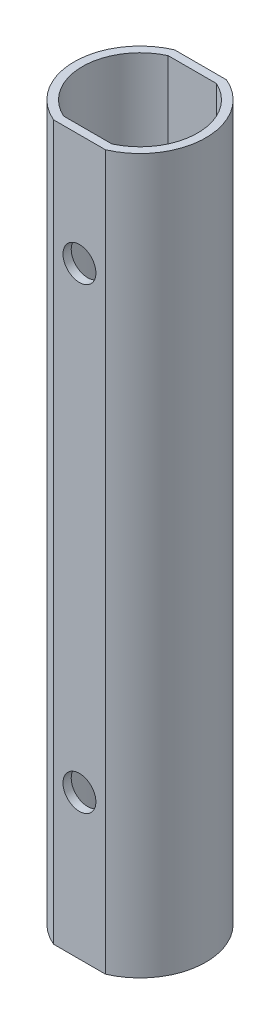
ISO-10303-21;
HEADER;
FILE_DESCRIPTION(('STEP AP214'),'2;1');
FILE_NAME('part.step','',(''),(''),'','','');
FILE_SCHEMA(('AUTOMOTIVE_DESIGN { 1 0 10303 214 1 1 1 1 }'));
ENDSEC;
DATA;
#1=APPLICATION_CONTEXT('core data for automotive mechanical design processes');
#2=APPLICATION_PROTOCOL_DEFINITION('international standard','automotive_design',2000,#1);
#3=PRODUCT_CONTEXT('',#1,'mechanical');
#4=PRODUCT('Part','Part','',(#3));
#5=PRODUCT_RELATED_PRODUCT_CATEGORY('part','',(#4));
#6=PRODUCT_DEFINITION_FORMATION('','',#4);
#7=PRODUCT_DEFINITION_CONTEXT('part definition',#1,'design');
#8=PRODUCT_DEFINITION('design','',#6,#7);
#9=PRODUCT_DEFINITION_SHAPE('','',#8);
#10=(LENGTH_UNIT() NAMED_UNIT(*) SI_UNIT(.MILLI.,.METRE.));
#11=(NAMED_UNIT(*) PLANE_ANGLE_UNIT() SI_UNIT($,.RADIAN.));
#12=(NAMED_UNIT(*) SI_UNIT($,.STERADIAN.) SOLID_ANGLE_UNIT());
#13=UNCERTAINTY_MEASURE_WITH_UNIT(LENGTH_MEASURE(1.E-05),#10,'distance_accuracy_value','');
#14=(GEOMETRIC_REPRESENTATION_CONTEXT(3) GLOBAL_UNCERTAINTY_ASSIGNED_CONTEXT((#13)) GLOBAL_UNIT_ASSIGNED_CONTEXT((#10,
#11,#12)) REPRESENTATION_CONTEXT('',''));
#15=CARTESIAN_POINT('',(0.,0.,0.));
#16=DIRECTION('',(0.,0.,1.));
#17=DIRECTION('',(1.,0.,0.));
#18=AXIS2_PLACEMENT_3D('',#15,#16,#17);
#19=CARTESIAN_POINT('',(0.,137.66,0.));
#20=DIRECTION('',(0.,1.,0.));
#21=DIRECTION('',(0.,0.,1.));
#22=AXIS2_PLACEMENT_3D('',#19,#20,#21);
#23=PLANE('',#22);
#24=CARTESIAN_POINT('',(0.,137.66,0.));
#25=DIRECTION('',(0.,1.,0.));
#26=DIRECTION('',(0.,0.,1.));
#27=AXIS2_PLACEMENT_3D('',#24,#25,#26);
#28=CIRCLE('',#27,12.7);
#29=CARTESIAN_POINT('',(-5.,137.66,-11.6743308159397));
#30=VERTEX_POINT('',#29);
#31=CARTESIAN_POINT('',(-5.,137.66,11.6743308159397));
#32=VERTEX_POINT('',#31);
#33=EDGE_CURVE('E142',#30,#32,#28,.T.);
#34=ORIENTED_EDGE('',*,*,#33,.T.);
#35=DIRECTION('',(1.,0.,0.));
#36=VECTOR('',#35,1.);
#37=CARTESIAN_POINT('',(-5.,137.66,11.6743308159397));
#38=LINE('',#37,#36);
#39=CARTESIAN_POINT('',(5.,137.66,11.6743308159397));
#40=VERTEX_POINT('',#39);
#41=EDGE_CURVE('E145',#32,#40,#38,.T.);
#42=ORIENTED_EDGE('',*,*,#41,.T.);
#43=CARTESIAN_POINT('',(0.,137.66,0.));
#44=DIRECTION('',(0.,1.,0.));
#45=DIRECTION('',(0.,0.,1.));
#46=AXIS2_PLACEMENT_3D('',#43,#44,#45);
#47=CIRCLE('',#46,12.7);
#48=CARTESIAN_POINT('',(5.,137.66,-11.6743308159397));
#49=VERTEX_POINT('',#48);
#50=EDGE_CURVE('E148',#40,#49,#47,.T.);
#51=ORIENTED_EDGE('',*,*,#50,.T.);
#52=DIRECTION('',(-1.,0.,0.));
#53=VECTOR('',#52,1.);
#54=CARTESIAN_POINT('',(-5.,137.66,-11.6743308159397));
#55=LINE('',#54,#53);
#56=EDGE_CURVE('E150',#49,#30,#55,.T.);
#57=ORIENTED_EDGE('',*,*,#56,.T.);
#58=EDGE_LOOP('',(#34,#42,#51,#57));
#59=FACE_BOUND('',#58,.T.);
#60=DIRECTION('',(1.,0.,0.));
#61=VECTOR('',#60,1.);
#62=CARTESIAN_POINT('',(-4.66299263784629,137.66,10.0868308159397));
#63=LINE('',#62,#61);
#64=CARTESIAN_POINT('',(-4.66299263784629,137.66,10.0868308159397));
#65=VERTEX_POINT('',#64);
#66=CARTESIAN_POINT('',(4.66299263784629,137.66,10.0868308159397));
#67=VERTEX_POINT('',#66);
#68=EDGE_CURVE('E112',#65,#67,#63,.T.);
#69=ORIENTED_EDGE('',*,*,#68,.F.);
#70=CARTESIAN_POINT('',(0.,137.66,0.));
#71=DIRECTION('',(0.,1.,0.));
#72=DIRECTION('',(0.,0.,1.));
#73=AXIS2_PLACEMENT_3D('',#70,#71,#72);
#74=CIRCLE('',#73,11.1125);
#75=CARTESIAN_POINT('',(-4.66299263784628,137.66,-10.0868308159397));
#76=VERTEX_POINT('',#75);
#77=EDGE_CURVE('E104',#76,#65,#74,.T.);
#78=ORIENTED_EDGE('',*,*,#77,.F.);
#79=DIRECTION('',(-1.,0.,0.));
#80=VECTOR('',#79,1.);
#81=CARTESIAN_POINT('',(-4.66299263784628,137.66,-10.0868308159397));
#82=LINE('',#81,#80);
#83=CARTESIAN_POINT('',(4.66299263784629,137.66,-10.0868308159397));
#84=VERTEX_POINT('',#83);
#85=EDGE_CURVE('E126',#84,#76,#82,.T.);
#86=ORIENTED_EDGE('',*,*,#85,.F.);
#87=CARTESIAN_POINT('',(0.,137.66,0.));
#88=DIRECTION('',(0.,1.,0.));
#89=DIRECTION('',(0.,0.,1.));
#90=AXIS2_PLACEMENT_3D('',#87,#88,#89);
#91=CIRCLE('',#90,11.1125);
#92=EDGE_CURVE('E124',#67,#84,#91,.T.);
#93=ORIENTED_EDGE('',*,*,#92,.F.);
#94=EDGE_LOOP('',(#69,#78,#86,#93));
#95=FACE_BOUND('',#94,.T.);
#96=ADVANCED_FACE('F37',(#59,#95),#23,.T.);
#97=CARTESIAN_POINT('',(0.,0.,0.));
#98=DIRECTION('',(0.,1.,0.));
#99=DIRECTION('',(0.,0.,1.));
#100=AXIS2_PLACEMENT_3D('',#97,#98,#99);
#101=PLANE('',#100);
#102=CARTESIAN_POINT('',(0.,0.,0.));
#103=DIRECTION('',(0.,1.,0.));
#104=DIRECTION('',(0.,0.,1.));
#105=AXIS2_PLACEMENT_3D('',#102,#103,#104);
#106=CIRCLE('',#105,12.7);
#107=CARTESIAN_POINT('',(-5.,0.,-11.6743308159397));
#108=VERTEX_POINT('',#107);
#109=CARTESIAN_POINT('',(-5.,0.,11.6743308159397));
#110=VERTEX_POINT('',#109);
#111=EDGE_CURVE('E120',#108,#110,#106,.T.);
#112=ORIENTED_EDGE('',*,*,#111,.F.);
#113=DIRECTION('',(-1.,0.,0.));
#114=VECTOR('',#113,1.);
#115=CARTESIAN_POINT('',(-5.,0.,-11.6743308159397));
#116=LINE('',#115,#114);
#117=CARTESIAN_POINT('',(5.,0.,-11.6743308159397));
#118=VERTEX_POINT('',#117);
#119=EDGE_CURVE('E146',#118,#108,#116,.T.);
#120=ORIENTED_EDGE('',*,*,#119,.F.);
#121=CARTESIAN_POINT('',(0.,0.,0.));
#122=DIRECTION('',(0.,1.,0.));
#123=DIRECTION('',(0.,0.,1.));
#124=AXIS2_PLACEMENT_3D('',#121,#122,#123);
#125=CIRCLE('',#124,12.7);
#126=CARTESIAN_POINT('',(5.,0.,11.6743308159397));
#127=VERTEX_POINT('',#126);
#128=EDGE_CURVE('E157',#127,#118,#125,.T.);
#129=ORIENTED_EDGE('',*,*,#128,.F.);
#130=DIRECTION('',(1.,0.,0.));
#131=VECTOR('',#130,1.);
#132=CARTESIAN_POINT('',(-5.,0.,11.6743308159397));
#133=LINE('',#132,#131);
#134=EDGE_CURVE('E155',#110,#127,#133,.T.);
#135=ORIENTED_EDGE('',*,*,#134,.F.);
#136=EDGE_LOOP('',(#112,#120,#129,#135));
#137=FACE_BOUND('',#136,.T.);
#138=CARTESIAN_POINT('',(0.,0.,0.));
#139=DIRECTION('',(0.,1.,0.));
#140=DIRECTION('',(0.,0.,1.));
#141=AXIS2_PLACEMENT_3D('',#138,#139,#140);
#142=CIRCLE('',#141,11.1125);
#143=CARTESIAN_POINT('',(-4.66299263784628,0.,-10.0868308159397));
#144=VERTEX_POINT('',#143);
#145=CARTESIAN_POINT('',(-4.66299263784629,0.,10.0868308159397));
#146=VERTEX_POINT('',#145);
#147=EDGE_CURVE('E62',#144,#146,#142,.T.);
#148=ORIENTED_EDGE('',*,*,#147,.T.);
#149=DIRECTION('',(1.,0.,0.));
#150=VECTOR('',#149,1.);
#151=CARTESIAN_POINT('',(-4.66299263784629,0.,10.0868308159397));
#152=LINE('',#151,#150);
#153=CARTESIAN_POINT('',(4.66299263784629,0.,10.0868308159397));
#154=VERTEX_POINT('',#153);
#155=EDGE_CURVE('E119',#146,#154,#152,.T.);
#156=ORIENTED_EDGE('',*,*,#155,.T.);
#157=CARTESIAN_POINT('',(0.,0.,0.));
#158=DIRECTION('',(0.,1.,0.));
#159=DIRECTION('',(0.,0.,1.));
#160=AXIS2_PLACEMENT_3D('',#157,#158,#159);
#161=CIRCLE('',#160,11.1125);
#162=CARTESIAN_POINT('',(4.66299263784629,0.,-10.0868308159397));
#163=VERTEX_POINT('',#162);
#164=EDGE_CURVE('E134',#154,#163,#161,.T.);
#165=ORIENTED_EDGE('',*,*,#164,.T.);
#166=DIRECTION('',(-1.,0.,0.));
#167=VECTOR('',#166,1.);
#168=CARTESIAN_POINT('',(-4.66299263784628,0.,-10.0868308159397));
#169=LINE('',#168,#167);
#170=EDGE_CURVE('E113',#163,#144,#169,.T.);
#171=ORIENTED_EDGE('',*,*,#170,.T.);
#172=EDGE_LOOP('',(#148,#156,#165,#171));
#173=FACE_BOUND('',#172,.T.);
#174=ADVANCED_FACE('F204',(#137,#173),#101,.F.);
#175=CARTESIAN_POINT('',(0.,137.66,0.));
#176=DIRECTION('',(0.,-1.,0.));
#177=DIRECTION('',(0.,0.,-1.));
#178=AXIS2_PLACEMENT_3D('',#175,#176,#177);
#179=CYLINDRICAL_SURFACE('',#178,12.7);
#180=ORIENTED_EDGE('',*,*,#111,.T.);
#181=DIRECTION('',(0.,-1.,0.));
#182=VECTOR('',#181,1.);
#183=CARTESIAN_POINT('',(-5.,137.66,11.6743308159397));
#184=LINE('',#183,#182);
#185=EDGE_CURVE('E11',#32,#110,#184,.T.);
#186=ORIENTED_EDGE('',*,*,#185,.F.);
#187=ORIENTED_EDGE('',*,*,#33,.F.);
#188=DIRECTION('',(0.,-1.,0.));
#189=VECTOR('',#188,1.);
#190=CARTESIAN_POINT('',(-5.,137.66,-11.6743308159397));
#191=LINE('',#190,#189);
#192=EDGE_CURVE('E152',#30,#108,#191,.T.);
#193=ORIENTED_EDGE('',*,*,#192,.T.);
#194=EDGE_LOOP('',(#180,#186,#187,#193));
#195=FACE_BOUND('',#194,.T.);
#196=ADVANCED_FACE('F39',(#195),#179,.T.);
#197=CARTESIAN_POINT('',(-5.,137.66,11.6743308159397));
#198=DIRECTION('',(0.,0.,-1.));
#199=DIRECTION('',(-1.,0.,0.));
#200=AXIS2_PLACEMENT_3D('',#197,#198,#199);
#201=PLANE('',#200);
#202=CARTESIAN_POINT('',(0.,27.85,11.6743308159397));
#203=DIRECTION('',(0.,0.,-1.));
#204=DIRECTION('',(-1.,0.,0.));
#205=AXIS2_PLACEMENT_3D('',#202,#203,#204);
#206=CIRCLE('',#205,3.175);
#207=CARTESIAN_POINT('',(-3.175,27.85,11.6743308159397));
#208=VERTEX_POINT('',#207);
#209=EDGE_CURVE('E169',#208,#208,#206,.F.);
#210=ORIENTED_EDGE('',*,*,#209,.F.);
#211=EDGE_LOOP('',(#210));
#212=FACE_BOUND('',#211,.T.);
#213=CARTESIAN_POINT('',(0.,116.16,11.6743308159397));
#214=DIRECTION('',(0.,0.,-1.));
#215=DIRECTION('',(-1.,0.,0.));
#216=AXIS2_PLACEMENT_3D('',#213,#214,#215);
#217=CIRCLE('',#216,3.175);
#218=CARTESIAN_POINT('',(-3.175,116.16,11.6743308159397));
#219=VERTEX_POINT('',#218);
#220=EDGE_CURVE('E183',#219,#219,#217,.F.);
#221=ORIENTED_EDGE('',*,*,#220,.F.);
#222=EDGE_LOOP('',(#221));
#223=FACE_BOUND('',#222,.T.);
#224=ORIENTED_EDGE('',*,*,#134,.T.);
#225=DIRECTION('',(0.,-1.,0.));
#226=VECTOR('',#225,1.);
#227=CARTESIAN_POINT('',(5.,137.66,11.6743308159397));
#228=LINE('',#227,#226);
#229=EDGE_CURVE('E46',#40,#127,#228,.T.);
#230=ORIENTED_EDGE('',*,*,#229,.F.);
#231=ORIENTED_EDGE('',*,*,#41,.F.);
#232=ORIENTED_EDGE('',*,*,#185,.T.);
#233=EDGE_LOOP('',(#224,#230,#231,#232));
#234=FACE_BOUND('',#233,.T.);
#235=ADVANCED_FACE('F229',(#212,#223,#234),#201,.F.);
#236=CARTESIAN_POINT('',(0.,137.66,0.));
#237=DIRECTION('',(0.,-1.,0.));
#238=DIRECTION('',(0.,0.,-1.));
#239=AXIS2_PLACEMENT_3D('',#236,#237,#238);
#240=CYLINDRICAL_SURFACE('',#239,12.7);
#241=ORIENTED_EDGE('',*,*,#128,.T.);
#242=DIRECTION('',(0.,-1.,0.));
#243=VECTOR('',#242,1.);
#244=CARTESIAN_POINT('',(5.,137.66,-11.6743308159397));
#245=LINE('',#244,#243);
#246=EDGE_CURVE('E162',#49,#118,#245,.T.);
#247=ORIENTED_EDGE('',*,*,#246,.F.);
#248=ORIENTED_EDGE('',*,*,#50,.F.);
#249=ORIENTED_EDGE('',*,*,#229,.T.);
#250=EDGE_LOOP('',(#241,#247,#248,#249));
#251=FACE_BOUND('',#250,.T.);
#252=ADVANCED_FACE('F226',(#251),#240,.T.);
#253=CARTESIAN_POINT('',(-5.,137.66,-11.6743308159397));
#254=DIRECTION('',(0.,0.,1.));
#255=DIRECTION('',(1.,0.,0.));
#256=AXIS2_PLACEMENT_3D('',#253,#254,#255);
#257=PLANE('',#256);
#258=CARTESIAN_POINT('',(0.,27.85,-11.6743308159397));
#259=DIRECTION('',(0.,0.,-1.));
#260=DIRECTION('',(-1.,0.,0.));
#261=AXIS2_PLACEMENT_3D('',#258,#259,#260);
#262=CIRCLE('',#261,3.175);
#263=CARTESIAN_POINT('',(-3.175,27.85,-11.6743308159397));
#264=VERTEX_POINT('',#263);
#265=EDGE_CURVE('E175',#264,#264,#262,.T.);
#266=ORIENTED_EDGE('',*,*,#265,.F.);
#267=EDGE_LOOP('',(#266));
#268=FACE_BOUND('',#267,.T.);
#269=CARTESIAN_POINT('',(0.,116.16,-11.6743308159397));
#270=DIRECTION('',(0.,0.,-1.));
#271=DIRECTION('',(-1.,0.,0.));
#272=AXIS2_PLACEMENT_3D('',#269,#270,#271);
#273=CIRCLE('',#272,3.175);
#274=CARTESIAN_POINT('',(-3.175,116.16,-11.6743308159397));
#275=VERTEX_POINT('',#274);
#276=EDGE_CURVE('E180',#275,#275,#273,.T.);
#277=ORIENTED_EDGE('',*,*,#276,.F.);
#278=EDGE_LOOP('',(#277));
#279=FACE_BOUND('',#278,.T.);
#280=ORIENTED_EDGE('',*,*,#119,.T.);
#281=ORIENTED_EDGE('',*,*,#192,.F.);
#282=ORIENTED_EDGE('',*,*,#56,.F.);
#283=ORIENTED_EDGE('',*,*,#246,.T.);
#284=EDGE_LOOP('',(#280,#281,#282,#283));
#285=FACE_BOUND('',#284,.T.);
#286=ADVANCED_FACE('F223',(#268,#279,#285),#257,.F.);
#287=CARTESIAN_POINT('',(0.,137.66,0.));
#288=DIRECTION('',(0.,-1.,0.));
#289=DIRECTION('',(0.,0.,-1.));
#290=AXIS2_PLACEMENT_3D('',#287,#288,#289);
#291=CYLINDRICAL_SURFACE('',#290,11.1125);
#292=ORIENTED_EDGE('',*,*,#147,.F.);
#293=DIRECTION('',(0.,-1.,0.));
#294=VECTOR('',#293,1.);
#295=CARTESIAN_POINT('',(-4.66299263784628,137.66,-10.0868308159397));
#296=LINE('',#295,#294);
#297=EDGE_CURVE('E108',#76,#144,#296,.T.);
#298=ORIENTED_EDGE('',*,*,#297,.F.);
#299=ORIENTED_EDGE('',*,*,#77,.T.);
#300=DIRECTION('',(0.,-1.,0.));
#301=VECTOR('',#300,1.);
#302=CARTESIAN_POINT('',(-4.66299263784629,137.66,10.0868308159397));
#303=LINE('',#302,#301);
#304=EDGE_CURVE('E107',#65,#146,#303,.T.);
#305=ORIENTED_EDGE('',*,*,#304,.T.);
#306=EDGE_LOOP('',(#292,#298,#299,#305));
#307=FACE_BOUND('',#306,.T.);
#308=ADVANCED_FACE('F106',(#307),#291,.F.);
#309=CARTESIAN_POINT('',(-4.66299263784629,137.66,10.0868308159397));
#310=DIRECTION('',(0.,0.,-1.));
#311=DIRECTION('',(-1.,0.,0.));
#312=AXIS2_PLACEMENT_3D('',#309,#310,#311);
#313=PLANE('',#312);
#314=CARTESIAN_POINT('',(0.,27.85,10.0868308159397));
#315=DIRECTION('',(0.,0.,-1.));
#316=DIRECTION('',(-1.,0.,0.));
#317=AXIS2_PLACEMENT_3D('',#314,#315,#316);
#318=CIRCLE('',#317,3.175);
#319=CARTESIAN_POINT('',(-3.175,27.85,10.0868308159397));
#320=VERTEX_POINT('',#319);
#321=EDGE_CURVE('E132',#320,#320,#318,.T.);
#322=ORIENTED_EDGE('',*,*,#321,.F.);
#323=EDGE_LOOP('',(#322));
#324=FACE_BOUND('',#323,.T.);
#325=CARTESIAN_POINT('',(0.,116.16,10.0868308159397));
#326=DIRECTION('',(0.,0.,-1.));
#327=DIRECTION('',(-1.,0.,0.));
#328=AXIS2_PLACEMENT_3D('',#325,#326,#327);
#329=CIRCLE('',#328,3.175);
#330=CARTESIAN_POINT('',(-3.175,116.16,10.0868308159397));
#331=VERTEX_POINT('',#330);
#332=EDGE_CURVE('E168',#331,#331,#329,.T.);
#333=ORIENTED_EDGE('',*,*,#332,.F.);
#334=EDGE_LOOP('',(#333));
#335=FACE_BOUND('',#334,.T.);
#336=ORIENTED_EDGE('',*,*,#155,.F.);
#337=ORIENTED_EDGE('',*,*,#304,.F.);
#338=ORIENTED_EDGE('',*,*,#68,.T.);
#339=DIRECTION('',(0.,-1.,0.));
#340=VECTOR('',#339,1.);
#341=CARTESIAN_POINT('',(4.66299263784629,137.66,10.0868308159397));
#342=LINE('',#341,#340);
#343=EDGE_CURVE('E121',#67,#154,#342,.T.);
#344=ORIENTED_EDGE('',*,*,#343,.T.);
#345=EDGE_LOOP('',(#336,#337,#338,#344));
#346=FACE_BOUND('',#345,.T.);
#347=ADVANCED_FACE('F116',(#324,#335,#346),#313,.T.);
#348=CARTESIAN_POINT('',(0.,137.66,0.));
#349=DIRECTION('',(0.,-1.,0.));
#350=DIRECTION('',(0.,0.,-1.));
#351=AXIS2_PLACEMENT_3D('',#348,#349,#350);
#352=CYLINDRICAL_SURFACE('',#351,11.1125);
#353=ORIENTED_EDGE('',*,*,#164,.F.);
#354=ORIENTED_EDGE('',*,*,#343,.F.);
#355=ORIENTED_EDGE('',*,*,#92,.T.);
#356=DIRECTION('',(0.,-1.,0.));
#357=VECTOR('',#356,1.);
#358=CARTESIAN_POINT('',(4.66299263784629,137.66,-10.0868308159397));
#359=LINE('',#358,#357);
#360=EDGE_CURVE('E54',#84,#163,#359,.T.);
#361=ORIENTED_EDGE('',*,*,#360,.T.);
#362=EDGE_LOOP('',(#353,#354,#355,#361));
#363=FACE_BOUND('',#362,.T.);
#364=ADVANCED_FACE('F200',(#363),#352,.F.);
#365=CARTESIAN_POINT('',(-4.66299263784628,137.66,-10.0868308159397));
#366=DIRECTION('',(0.,0.,1.));
#367=DIRECTION('',(1.,0.,0.));
#368=AXIS2_PLACEMENT_3D('',#365,#366,#367);
#369=PLANE('',#368);
#370=CARTESIAN_POINT('',(0.,27.85,-10.0868308159397));
#371=DIRECTION('',(0.,0.,1.));
#372=DIRECTION('',(1.,0.,0.));
#373=AXIS2_PLACEMENT_3D('',#370,#371,#372);
#374=CIRCLE('',#373,3.175);
#375=CARTESIAN_POINT('',(3.175,27.85,-10.0868308159397));
#376=VERTEX_POINT('',#375);
#377=EDGE_CURVE('E41',#376,#376,#374,.T.);
#378=ORIENTED_EDGE('',*,*,#377,.F.);
#379=EDGE_LOOP('',(#378));
#380=FACE_BOUND('',#379,.T.);
#381=CARTESIAN_POINT('',(0.,116.16,-10.0868308159397));
#382=DIRECTION('',(0.,0.,1.));
#383=DIRECTION('',(1.,0.,0.));
#384=AXIS2_PLACEMENT_3D('',#381,#382,#383);
#385=CIRCLE('',#384,3.175);
#386=CARTESIAN_POINT('',(3.175,116.16,-10.0868308159397));
#387=VERTEX_POINT('',#386);
#388=EDGE_CURVE('E166',#387,#387,#385,.T.);
#389=ORIENTED_EDGE('',*,*,#388,.F.);
#390=EDGE_LOOP('',(#389));
#391=FACE_BOUND('',#390,.T.);
#392=ORIENTED_EDGE('',*,*,#170,.F.);
#393=ORIENTED_EDGE('',*,*,#360,.F.);
#394=ORIENTED_EDGE('',*,*,#85,.T.);
#395=ORIENTED_EDGE('',*,*,#297,.T.);
#396=EDGE_LOOP('',(#392,#393,#394,#395));
#397=FACE_BOUND('',#396,.T.);
#398=ADVANCED_FACE('F196',(#380,#391,#397),#369,.T.);
#399=CARTESIAN_POINT('',(0.,116.16,20.6545869370089));
#400=DIRECTION('',(0.,0.,-1.));
#401=DIRECTION('',(-1.,0.,0.));
#402=AXIS2_PLACEMENT_3D('',#399,#400,#401);
#403=CYLINDRICAL_SURFACE('',#402,3.175);
#404=ORIENTED_EDGE('',*,*,#388,.T.);
#405=EDGE_LOOP('',(#404));
#406=FACE_BOUND('',#405,.T.);
#407=ORIENTED_EDGE('',*,*,#276,.T.);
#408=EDGE_LOOP('',(#407));
#409=FACE_BOUND('',#408,.T.);
#410=ADVANCED_FACE('F199',(#406,#409),#403,.F.);
#411=CARTESIAN_POINT('',(0.,27.85,20.6545869370089));
#412=DIRECTION('',(0.,0.,-1.));
#413=DIRECTION('',(-1.,0.,0.));
#414=AXIS2_PLACEMENT_3D('',#411,#412,#413);
#415=CYLINDRICAL_SURFACE('',#414,3.175);
#416=ORIENTED_EDGE('',*,*,#377,.T.);
#417=EDGE_LOOP('',(#416));
#418=FACE_BOUND('',#417,.T.);
#419=ORIENTED_EDGE('',*,*,#265,.T.);
#420=EDGE_LOOP('',(#419));
#421=FACE_BOUND('',#420,.T.);
#422=ADVANCED_FACE('F193',(#418,#421),#415,.F.);
#423=ORIENTED_EDGE('',*,*,#332,.T.);
#424=EDGE_LOOP('',(#423));
#425=FACE_BOUND('',#424,.T.);
#426=ORIENTED_EDGE('',*,*,#220,.T.);
#427=EDGE_LOOP('',(#426));
#428=FACE_BOUND('',#427,.T.);
#429=ADVANCED_FACE('F252',(#425,#428),#403,.F.);
#430=ORIENTED_EDGE('',*,*,#321,.T.);
#431=EDGE_LOOP('',(#430));
#432=FACE_BOUND('',#431,.T.);
#433=ORIENTED_EDGE('',*,*,#209,.T.);
#434=EDGE_LOOP('',(#433));
#435=FACE_BOUND('',#434,.T.);
#436=ADVANCED_FACE('F254',(#432,#435),#415,.F.);
#437=CLOSED_SHELL('',(#96,#174,#196,#235,#252,#286,#308,#347,#364,#398,#410,#422,#429,#436));
#438=MANIFOLD_SOLID_BREP('B2',#437);
#439=ADVANCED_BREP_SHAPE_REPRESENTATION('',(#18,#438),#14);
#440=SHAPE_DEFINITION_REPRESENTATION(#9,#439);
ENDSEC;
END-ISO-10303-21;
